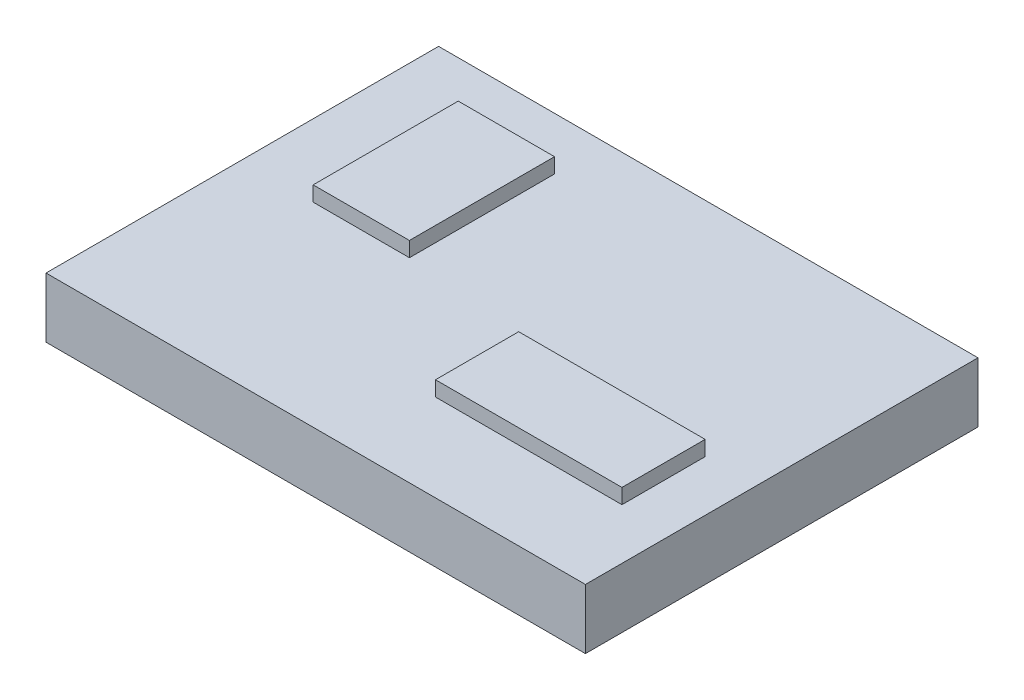
ISO-10303-21;
HEADER;
FILE_DESCRIPTION(('STEP AP214'),'2;1');
FILE_NAME('part.step','',(''),(''),'','','');
FILE_SCHEMA(('AUTOMOTIVE_DESIGN { 1 0 10303 214 1 1 1 1 }'));
ENDSEC;
DATA;
#1=APPLICATION_CONTEXT('core data for automotive mechanical design processes');
#2=APPLICATION_PROTOCOL_DEFINITION('international standard','automotive_design',2000,#1);
#3=PRODUCT_CONTEXT('',#1,'mechanical');
#4=PRODUCT('Part','Part','',(#3));
#5=PRODUCT_RELATED_PRODUCT_CATEGORY('part','',(#4));
#6=PRODUCT_DEFINITION_FORMATION('','',#4);
#7=PRODUCT_DEFINITION_CONTEXT('part definition',#1,'design');
#8=PRODUCT_DEFINITION('design','',#6,#7);
#9=PRODUCT_DEFINITION_SHAPE('','',#8);
#10=(LENGTH_UNIT() NAMED_UNIT(*) SI_UNIT(.MILLI.,.METRE.));
#11=(NAMED_UNIT(*) PLANE_ANGLE_UNIT() SI_UNIT($,.RADIAN.));
#12=(NAMED_UNIT(*) SI_UNIT($,.STERADIAN.) SOLID_ANGLE_UNIT());
#13=UNCERTAINTY_MEASURE_WITH_UNIT(LENGTH_MEASURE(1.E-05),#10,'distance_accuracy_value','');
#14=(GEOMETRIC_REPRESENTATION_CONTEXT(3) GLOBAL_UNCERTAINTY_ASSIGNED_CONTEXT((#13)) GLOBAL_UNIT_ASSIGNED_CONTEXT((#10,
#11,#12)) REPRESENTATION_CONTEXT('',''));
#15=CARTESIAN_POINT('',(0.,0.,0.));
#16=DIRECTION('',(0.,0.,1.));
#17=DIRECTION('',(1.,0.,0.));
#18=AXIS2_PLACEMENT_3D('',#15,#16,#17);
#19=CARTESIAN_POINT('',(0.,2.,0.));
#20=DIRECTION('',(0.,-1.,0.));
#21=DIRECTION('',(0.,0.,-1.));
#22=AXIS2_PLACEMENT_3D('',#19,#20,#21);
#23=PLANE('',#22);
#24=DIRECTION('',(0.,0.,1.));
#25=VECTOR('',#24,1.);
#26=CARTESIAN_POINT('',(2.40979553414755,2.,-11.3458514588061));
#27=LINE('',#26,#25);
#28=CARTESIAN_POINT('',(2.40979553414755,2.,-11.3458514588061));
#29=VERTEX_POINT('',#28);
#30=CARTESIAN_POINT('',(2.40979553414755,2.,-6.5048405479633));
#31=VERTEX_POINT('',#30);
#32=EDGE_CURVE('E142',#29,#31,#27,.T.);
#33=ORIENTED_EDGE('',*,*,#32,.F.);
#34=DIRECTION('',(-1.,0.,0.));
#35=VECTOR('',#34,1.);
#36=CARTESIAN_POINT('',(2.40979553414755,2.,-11.3458514588061));
#37=LINE('',#36,#35);
#38=CARTESIAN_POINT('',(5.6225188599015,2.,-11.3458514588061));
#39=VERTEX_POINT('',#38);
#40=EDGE_CURVE('E155',#39,#29,#37,.T.);
#41=ORIENTED_EDGE('',*,*,#40,.F.);
#42=DIRECTION('',(0.,0.,-1.));
#43=VECTOR('',#42,1.);
#44=CARTESIAN_POINT('',(5.6225188599015,2.,-11.3458514588061));
#45=LINE('',#44,#43);
#46=CARTESIAN_POINT('',(5.6225188599015,2.,-6.5048405479633));
#47=VERTEX_POINT('',#46);
#48=EDGE_CURVE('E164',#47,#39,#45,.T.);
#49=ORIENTED_EDGE('',*,*,#48,.F.);
#50=DIRECTION('',(1.,0.,0.));
#51=VECTOR('',#50,1.);
#52=CARTESIAN_POINT('',(2.40979553414755,2.,-6.5048405479633));
#53=LINE('',#52,#51);
#54=EDGE_CURVE('E145',#31,#47,#53,.T.);
#55=ORIENTED_EDGE('',*,*,#54,.F.);
#56=EDGE_LOOP('',(#33,#41,#49,#55));
#57=FACE_BOUND('',#56,.T.);
#58=DIRECTION('',(0.,0.,1.));
#59=VECTOR('',#58,1.);
#60=CARTESIAN_POINT('',(0.,2.,0.));
#61=LINE('',#60,#59);
#62=CARTESIAN_POINT('',(0.,2.,-13.1));
#63=VERTEX_POINT('',#62);
#64=CARTESIAN_POINT('',(0.,2.,0.));
#65=VERTEX_POINT('',#64);
#66=EDGE_CURVE('E181',#63,#65,#61,.T.);
#67=ORIENTED_EDGE('',*,*,#66,.T.);
#68=DIRECTION('',(1.,0.,0.));
#69=VECTOR('',#68,1.);
#70=CARTESIAN_POINT('',(0.,2.,0.));
#71=LINE('',#70,#69);
#72=CARTESIAN_POINT('',(18.,2.,0.));
#73=VERTEX_POINT('',#72);
#74=EDGE_CURVE('E184',#65,#73,#71,.T.);
#75=ORIENTED_EDGE('',*,*,#74,.T.);
#76=DIRECTION('',(0.,0.,-1.));
#77=VECTOR('',#76,1.);
#78=CARTESIAN_POINT('',(18.,2.,0.));
#79=LINE('',#78,#77);
#80=CARTESIAN_POINT('',(18.,2.,-13.1));
#81=VERTEX_POINT('',#80);
#82=EDGE_CURVE('E187',#73,#81,#79,.T.);
#83=ORIENTED_EDGE('',*,*,#82,.T.);
#84=DIRECTION('',(-1.,0.,0.));
#85=VECTOR('',#84,1.);
#86=CARTESIAN_POINT('',(0.,2.,-13.1));
#87=LINE('',#86,#85);
#88=EDGE_CURVE('E189',#81,#63,#87,.T.);
#89=ORIENTED_EDGE('',*,*,#88,.T.);
#90=EDGE_LOOP('',(#67,#75,#83,#89));
#91=FACE_BOUND('',#90,.T.);
#92=DIRECTION('',(0.,0.,1.));
#93=VECTOR('',#92,1.);
#94=CARTESIAN_POINT('',(10.0829261034403,2.,-5.69027774882791));
#95=LINE('',#94,#93);
#96=CARTESIAN_POINT('',(10.0829261034403,2.,-5.69027774882791));
#97=VERTEX_POINT('',#96);
#98=CARTESIAN_POINT('',(10.0829261034403,2.,-2.91406371153791));
#99=VERTEX_POINT('',#98);
#100=EDGE_CURVE('E141',#97,#99,#95,.T.);
#101=ORIENTED_EDGE('',*,*,#100,.F.);
#102=DIRECTION('',(-1.,0.,0.));
#103=VECTOR('',#102,1.);
#104=CARTESIAN_POINT('',(10.0829261034403,2.,-5.69027774882791));
#105=LINE('',#104,#103);
#106=CARTESIAN_POINT('',(16.3050454229077,2.,-5.69027774882791));
#107=VERTEX_POINT('',#106);
#108=EDGE_CURVE('E138',#107,#97,#105,.T.);
#109=ORIENTED_EDGE('',*,*,#108,.F.);
#110=DIRECTION('',(0.,0.,-1.));
#111=VECTOR('',#110,1.);
#112=CARTESIAN_POINT('',(16.3050454229077,2.,-5.69027774882791));
#113=LINE('',#112,#111);
#114=CARTESIAN_POINT('',(16.3050454229077,2.,-2.91406371153791));
#115=VERTEX_POINT('',#114);
#116=EDGE_CURVE('E52',#115,#107,#113,.T.);
#117=ORIENTED_EDGE('',*,*,#116,.F.);
#118=DIRECTION('',(1.,0.,0.));
#119=VECTOR('',#118,1.);
#120=CARTESIAN_POINT('',(10.0829261034403,2.,-2.91406371153791));
#121=LINE('',#120,#119);
#122=EDGE_CURVE('E47',#99,#115,#121,.T.);
#123=ORIENTED_EDGE('',*,*,#122,.F.);
#124=EDGE_LOOP('',(#101,#109,#117,#123));
#125=FACE_BOUND('',#124,.T.);
#126=ADVANCED_FACE('F32',(#57,#91,#125),#23,.F.);
#127=CARTESIAN_POINT('',(0.,2.,0.));
#128=DIRECTION('',(1.,0.,0.));
#129=DIRECTION('',(0.,0.,-1.));
#130=AXIS2_PLACEMENT_3D('',#127,#128,#129);
#131=PLANE('',#130);
#132=DIRECTION('',(0.,0.,1.));
#133=VECTOR('',#132,1.);
#134=CARTESIAN_POINT('',(0.,0.,0.));
#135=LINE('',#134,#133);
#136=CARTESIAN_POINT('',(0.,0.,-13.1));
#137=VERTEX_POINT('',#136);
#138=CARTESIAN_POINT('',(0.,0.,0.));
#139=VERTEX_POINT('',#138);
#140=EDGE_CURVE('E180',#137,#139,#135,.T.);
#141=ORIENTED_EDGE('',*,*,#140,.T.);
#142=DIRECTION('',(0.,-1.,0.));
#143=VECTOR('',#142,1.);
#144=CARTESIAN_POINT('',(0.,2.,0.));
#145=LINE('',#144,#143);
#146=EDGE_CURVE('E11',#65,#139,#145,.T.);
#147=ORIENTED_EDGE('',*,*,#146,.F.);
#148=ORIENTED_EDGE('',*,*,#66,.F.);
#149=DIRECTION('',(0.,-1.,0.));
#150=VECTOR('',#149,1.);
#151=CARTESIAN_POINT('',(0.,2.,-13.1));
#152=LINE('',#151,#150);
#153=EDGE_CURVE('E191',#63,#137,#152,.T.);
#154=ORIENTED_EDGE('',*,*,#153,.T.);
#155=EDGE_LOOP('',(#141,#147,#148,#154));
#156=FACE_BOUND('',#155,.T.);
#157=ADVANCED_FACE('F34',(#156),#131,.F.);
#158=CARTESIAN_POINT('',(0.,2.,0.));
#159=DIRECTION('',(0.,0.,-1.));
#160=DIRECTION('',(-1.,0.,0.));
#161=AXIS2_PLACEMENT_3D('',#158,#159,#160);
#162=PLANE('',#161);
#163=DIRECTION('',(1.,0.,0.));
#164=VECTOR('',#163,1.);
#165=CARTESIAN_POINT('',(0.,0.,0.));
#166=LINE('',#165,#164);
#167=CARTESIAN_POINT('',(18.,0.,0.));
#168=VERTEX_POINT('',#167);
#169=EDGE_CURVE('E194',#139,#168,#166,.T.);
#170=ORIENTED_EDGE('',*,*,#169,.T.);
#171=DIRECTION('',(0.,-1.,0.));
#172=VECTOR('',#171,1.);
#173=CARTESIAN_POINT('',(18.,2.,0.));
#174=LINE('',#173,#172);
#175=EDGE_CURVE('E40',#73,#168,#174,.T.);
#176=ORIENTED_EDGE('',*,*,#175,.F.);
#177=ORIENTED_EDGE('',*,*,#74,.F.);
#178=ORIENTED_EDGE('',*,*,#146,.T.);
#179=EDGE_LOOP('',(#170,#176,#177,#178));
#180=FACE_BOUND('',#179,.T.);
#181=ADVANCED_FACE('F223',(#180),#162,.F.);
#182=CARTESIAN_POINT('',(18.,2.,0.));
#183=DIRECTION('',(-1.,0.,0.));
#184=DIRECTION('',(0.,0.,1.));
#185=AXIS2_PLACEMENT_3D('',#182,#183,#184);
#186=PLANE('',#185);
#187=DIRECTION('',(0.,0.,-1.));
#188=VECTOR('',#187,1.);
#189=CARTESIAN_POINT('',(18.,0.,0.));
#190=LINE('',#189,#188);
#191=CARTESIAN_POINT('',(18.,0.,-13.1));
#192=VERTEX_POINT('',#191);
#193=EDGE_CURVE('E196',#168,#192,#190,.T.);
#194=ORIENTED_EDGE('',*,*,#193,.T.);
#195=DIRECTION('',(0.,-1.,0.));
#196=VECTOR('',#195,1.);
#197=CARTESIAN_POINT('',(18.,2.,-13.1));
#198=LINE('',#197,#196);
#199=EDGE_CURVE('E201',#81,#192,#198,.T.);
#200=ORIENTED_EDGE('',*,*,#199,.F.);
#201=ORIENTED_EDGE('',*,*,#82,.F.);
#202=ORIENTED_EDGE('',*,*,#175,.T.);
#203=EDGE_LOOP('',(#194,#200,#201,#202));
#204=FACE_BOUND('',#203,.T.);
#205=ADVANCED_FACE('F208',(#204),#186,.F.);
#206=CARTESIAN_POINT('',(0.,2.,-13.1));
#207=DIRECTION('',(0.,0.,1.));
#208=DIRECTION('',(1.,0.,0.));
#209=AXIS2_PLACEMENT_3D('',#206,#207,#208);
#210=PLANE('',#209);
#211=DIRECTION('',(-1.,0.,0.));
#212=VECTOR('',#211,1.);
#213=CARTESIAN_POINT('',(0.,0.,-13.1));
#214=LINE('',#213,#212);
#215=EDGE_CURVE('E185',#192,#137,#214,.T.);
#216=ORIENTED_EDGE('',*,*,#215,.T.);
#217=ORIENTED_EDGE('',*,*,#153,.F.);
#218=ORIENTED_EDGE('',*,*,#88,.F.);
#219=ORIENTED_EDGE('',*,*,#199,.T.);
#220=EDGE_LOOP('',(#216,#217,#218,#219));
#221=FACE_BOUND('',#220,.T.);
#222=ADVANCED_FACE('F217',(#221),#210,.F.);
#223=CARTESIAN_POINT('',(0.,0.,0.));
#224=DIRECTION('',(0.,-1.,0.));
#225=DIRECTION('',(0.,0.,-1.));
#226=AXIS2_PLACEMENT_3D('',#223,#224,#225);
#227=PLANE('',#226);
#228=ORIENTED_EDGE('',*,*,#140,.F.);
#229=ORIENTED_EDGE('',*,*,#215,.F.);
#230=ORIENTED_EDGE('',*,*,#193,.F.);
#231=ORIENTED_EDGE('',*,*,#169,.F.);
#232=EDGE_LOOP('',(#228,#229,#230,#231));
#233=FACE_BOUND('',#232,.T.);
#234=ADVANCED_FACE('F214',(#233),#227,.T.);
#235=CARTESIAN_POINT('',(2.40979553414755,2.5,-11.3458514588061));
#236=DIRECTION('',(1.,0.,0.));
#237=DIRECTION('',(0.,0.,-1.));
#238=AXIS2_PLACEMENT_3D('',#235,#236,#237);
#239=PLANE('',#238);
#240=ORIENTED_EDGE('',*,*,#32,.T.);
#241=DIRECTION('',(0.,-1.,0.));
#242=VECTOR('',#241,1.);
#243=CARTESIAN_POINT('',(2.40979553414755,2.5,-6.5048405479633));
#244=LINE('',#243,#242);
#245=CARTESIAN_POINT('',(2.40979553414755,2.5,-6.5048405479633));
#246=VERTEX_POINT('',#245);
#247=EDGE_CURVE('E177',#246,#31,#244,.T.);
#248=ORIENTED_EDGE('',*,*,#247,.F.);
#249=DIRECTION('',(0.,0.,1.));
#250=VECTOR('',#249,1.);
#251=CARTESIAN_POINT('',(2.40979553414755,2.5,-11.3458514588061));
#252=LINE('',#251,#250);
#253=CARTESIAN_POINT('',(2.40979553414755,2.5,-11.3458514588061));
#254=VERTEX_POINT('',#253);
#255=EDGE_CURVE('E151',#254,#246,#252,.T.);
#256=ORIENTED_EDGE('',*,*,#255,.F.);
#257=DIRECTION('',(0.,-1.,0.));
#258=VECTOR('',#257,1.);
#259=CARTESIAN_POINT('',(2.40979553414755,2.5,-11.3458514588061));
#260=LINE('',#259,#258);
#261=EDGE_CURVE('E160',#254,#29,#260,.T.);
#262=ORIENTED_EDGE('',*,*,#261,.T.);
#263=EDGE_LOOP('',(#240,#248,#256,#262));
#264=FACE_BOUND('',#263,.T.);
#265=ADVANCED_FACE('F237',(#264),#239,.F.);
#266=CARTESIAN_POINT('',(2.40979553414755,2.5,-6.5048405479633));
#267=DIRECTION('',(0.,0.,-1.));
#268=DIRECTION('',(-1.,0.,0.));
#269=AXIS2_PLACEMENT_3D('',#266,#267,#268);
#270=PLANE('',#269);
#271=ORIENTED_EDGE('',*,*,#54,.T.);
#272=DIRECTION('',(0.,-1.,0.));
#273=VECTOR('',#272,1.);
#274=CARTESIAN_POINT('',(5.6225188599015,2.5,-6.5048405479633));
#275=LINE('',#274,#273);
#276=CARTESIAN_POINT('',(5.6225188599015,2.5,-6.5048405479633));
#277=VERTEX_POINT('',#276);
#278=EDGE_CURVE('E174',#277,#47,#275,.T.);
#279=ORIENTED_EDGE('',*,*,#278,.F.);
#280=DIRECTION('',(1.,0.,0.));
#281=VECTOR('',#280,1.);
#282=CARTESIAN_POINT('',(2.40979553414755,2.5,-6.5048405479633));
#283=LINE('',#282,#281);
#284=EDGE_CURVE('E154',#246,#277,#283,.T.);
#285=ORIENTED_EDGE('',*,*,#284,.F.);
#286=ORIENTED_EDGE('',*,*,#247,.T.);
#287=EDGE_LOOP('',(#271,#279,#285,#286));
#288=FACE_BOUND('',#287,.T.);
#289=ADVANCED_FACE('F256',(#288),#270,.F.);
#290=CARTESIAN_POINT('',(5.6225188599015,2.5,-11.3458514588061));
#291=DIRECTION('',(-1.,0.,0.));
#292=DIRECTION('',(0.,0.,1.));
#293=AXIS2_PLACEMENT_3D('',#290,#291,#292);
#294=PLANE('',#293);
#295=ORIENTED_EDGE('',*,*,#48,.T.);
#296=DIRECTION('',(0.,-1.,0.));
#297=VECTOR('',#296,1.);
#298=CARTESIAN_POINT('',(5.6225188599015,2.5,-11.3458514588061));
#299=LINE('',#298,#297);
#300=CARTESIAN_POINT('',(5.6225188599015,2.5,-11.3458514588061));
#301=VERTEX_POINT('',#300);
#302=EDGE_CURVE('E171',#301,#39,#299,.T.);
#303=ORIENTED_EDGE('',*,*,#302,.F.);
#304=DIRECTION('',(0.,0.,-1.));
#305=VECTOR('',#304,1.);
#306=CARTESIAN_POINT('',(5.6225188599015,2.5,-11.3458514588061));
#307=LINE('',#306,#305);
#308=EDGE_CURVE('E157',#277,#301,#307,.T.);
#309=ORIENTED_EDGE('',*,*,#308,.F.);
#310=ORIENTED_EDGE('',*,*,#278,.T.);
#311=EDGE_LOOP('',(#295,#303,#309,#310));
#312=FACE_BOUND('',#311,.T.);
#313=ADVANCED_FACE('F263',(#312),#294,.F.);
#314=CARTESIAN_POINT('',(2.40979553414755,2.5,-11.3458514588061));
#315=DIRECTION('',(0.,0.,1.));
#316=DIRECTION('',(1.,0.,0.));
#317=AXIS2_PLACEMENT_3D('',#314,#315,#316);
#318=PLANE('',#317);
#319=ORIENTED_EDGE('',*,*,#40,.T.);
#320=ORIENTED_EDGE('',*,*,#261,.F.);
#321=DIRECTION('',(-1.,0.,0.));
#322=VECTOR('',#321,1.);
#323=CARTESIAN_POINT('',(2.40979553414755,2.5,-11.3458514588061));
#324=LINE('',#323,#322);
#325=EDGE_CURVE('E159',#301,#254,#324,.T.);
#326=ORIENTED_EDGE('',*,*,#325,.F.);
#327=ORIENTED_EDGE('',*,*,#302,.T.);
#328=EDGE_LOOP('',(#319,#320,#326,#327));
#329=FACE_BOUND('',#328,.T.);
#330=ADVANCED_FACE('F270',(#329),#318,.F.);
#331=CARTESIAN_POINT('',(0.,2.5,0.));
#332=DIRECTION('',(0.,1.,0.));
#333=DIRECTION('',(0.,0.,1.));
#334=AXIS2_PLACEMENT_3D('',#331,#332,#333);
#335=PLANE('',#334);
#336=ORIENTED_EDGE('',*,*,#255,.T.);
#337=ORIENTED_EDGE('',*,*,#284,.T.);
#338=ORIENTED_EDGE('',*,*,#308,.T.);
#339=ORIENTED_EDGE('',*,*,#325,.T.);
#340=EDGE_LOOP('',(#336,#337,#338,#339));
#341=FACE_BOUND('',#340,.T.);
#342=ADVANCED_FACE('F278',(#341),#335,.T.);
#343=CARTESIAN_POINT('',(10.0829261034403,2.5,-5.69027774882791));
#344=DIRECTION('',(1.,0.,0.));
#345=DIRECTION('',(0.,0.,-1.));
#346=AXIS2_PLACEMENT_3D('',#343,#344,#345);
#347=PLANE('',#346);
#348=ORIENTED_EDGE('',*,*,#100,.T.);
#349=DIRECTION('',(0.,-1.,0.));
#350=VECTOR('',#349,1.);
#351=CARTESIAN_POINT('',(10.0829261034403,2.5,-2.91406371153791));
#352=LINE('',#351,#350);
#353=CARTESIAN_POINT('',(10.0829261034403,2.5,-2.91406371153791));
#354=VERTEX_POINT('',#353);
#355=EDGE_CURVE('E122',#354,#99,#352,.T.);
#356=ORIENTED_EDGE('',*,*,#355,.F.);
#357=DIRECTION('',(0.,0.,1.));
#358=VECTOR('',#357,1.);
#359=CARTESIAN_POINT('',(10.0829261034403,2.5,-5.69027774882791));
#360=LINE('',#359,#358);
#361=CARTESIAN_POINT('',(10.0829261034403,2.5,-5.69027774882791));
#362=VERTEX_POINT('',#361);
#363=EDGE_CURVE('E129',#362,#354,#360,.T.);
#364=ORIENTED_EDGE('',*,*,#363,.F.);
#365=DIRECTION('',(0.,-1.,0.));
#366=VECTOR('',#365,1.);
#367=CARTESIAN_POINT('',(10.0829261034403,2.5,-5.69027774882791));
#368=LINE('',#367,#366);
#369=EDGE_CURVE('E367',#362,#97,#368,.T.);
#370=ORIENTED_EDGE('',*,*,#369,.T.);
#371=EDGE_LOOP('',(#348,#356,#364,#370));
#372=FACE_BOUND('',#371,.T.);
#373=ADVANCED_FACE('F140',(#372),#347,.F.);
#374=CARTESIAN_POINT('',(10.0829261034403,2.5,-2.91406371153791));
#375=DIRECTION('',(0.,0.,-1.));
#376=DIRECTION('',(-1.,0.,0.));
#377=AXIS2_PLACEMENT_3D('',#374,#375,#376);
#378=PLANE('',#377);
#379=ORIENTED_EDGE('',*,*,#122,.T.);
#380=DIRECTION('',(0.,-1.,0.));
#381=VECTOR('',#380,1.);
#382=CARTESIAN_POINT('',(16.3050454229077,2.5,-2.91406371153791));
#383=LINE('',#382,#381);
#384=CARTESIAN_POINT('',(16.3050454229077,2.5,-2.91406371153791));
#385=VERTEX_POINT('',#384);
#386=EDGE_CURVE('E125',#385,#115,#383,.T.);
#387=ORIENTED_EDGE('',*,*,#386,.F.);
#388=DIRECTION('',(1.,0.,0.));
#389=VECTOR('',#388,1.);
#390=CARTESIAN_POINT('',(10.0829261034403,2.5,-2.91406371153791));
#391=LINE('',#390,#389);
#392=EDGE_CURVE('E118',#354,#385,#391,.T.);
#393=ORIENTED_EDGE('',*,*,#392,.F.);
#394=ORIENTED_EDGE('',*,*,#355,.T.);
#395=EDGE_LOOP('',(#379,#387,#393,#394));
#396=FACE_BOUND('',#395,.T.);
#397=ADVANCED_FACE('F120',(#396),#378,.F.);
#398=CARTESIAN_POINT('',(16.3050454229077,2.5,-5.69027774882791));
#399=DIRECTION('',(-1.,0.,0.));
#400=DIRECTION('',(0.,0.,1.));
#401=AXIS2_PLACEMENT_3D('',#398,#399,#400);
#402=PLANE('',#401);
#403=ORIENTED_EDGE('',*,*,#116,.T.);
#404=DIRECTION('',(0.,-1.,0.));
#405=VECTOR('',#404,1.);
#406=CARTESIAN_POINT('',(16.3050454229077,2.5,-5.69027774882791));
#407=LINE('',#406,#405);
#408=CARTESIAN_POINT('',(16.3050454229077,2.5,-5.69027774882791));
#409=VERTEX_POINT('',#408);
#410=EDGE_CURVE('E147',#409,#107,#407,.T.);
#411=ORIENTED_EDGE('',*,*,#410,.F.);
#412=DIRECTION('',(0.,0.,-1.));
#413=VECTOR('',#412,1.);
#414=CARTESIAN_POINT('',(16.3050454229077,2.5,-5.69027774882791));
#415=LINE('',#414,#413);
#416=EDGE_CURVE('E128',#385,#409,#415,.T.);
#417=ORIENTED_EDGE('',*,*,#416,.F.);
#418=ORIENTED_EDGE('',*,*,#386,.T.);
#419=EDGE_LOOP('',(#403,#411,#417,#418));
#420=FACE_BOUND('',#419,.T.);
#421=ADVANCED_FACE('F299',(#420),#402,.F.);
#422=CARTESIAN_POINT('',(10.0829261034403,2.5,-5.69027774882791));
#423=DIRECTION('',(0.,0.,1.));
#424=DIRECTION('',(1.,0.,0.));
#425=AXIS2_PLACEMENT_3D('',#422,#423,#424);
#426=PLANE('',#425);
#427=ORIENTED_EDGE('',*,*,#108,.T.);
#428=ORIENTED_EDGE('',*,*,#369,.F.);
#429=DIRECTION('',(-1.,0.,0.));
#430=VECTOR('',#429,1.);
#431=CARTESIAN_POINT('',(10.0829261034403,2.5,-5.69027774882791));
#432=LINE('',#431,#430);
#433=EDGE_CURVE('E134',#409,#362,#432,.T.);
#434=ORIENTED_EDGE('',*,*,#433,.F.);
#435=ORIENTED_EDGE('',*,*,#410,.T.);
#436=EDGE_LOOP('',(#427,#428,#434,#435));
#437=FACE_BOUND('',#436,.T.);
#438=ADVANCED_FACE('F306',(#437),#426,.F.);
#439=CARTESIAN_POINT('',(0.,2.5,0.));
#440=DIRECTION('',(0.,1.,0.));
#441=DIRECTION('',(0.,0.,1.));
#442=AXIS2_PLACEMENT_3D('',#439,#440,#441);
#443=PLANE('',#442);
#444=ORIENTED_EDGE('',*,*,#363,.T.);
#445=ORIENTED_EDGE('',*,*,#392,.T.);
#446=ORIENTED_EDGE('',*,*,#416,.T.);
#447=ORIENTED_EDGE('',*,*,#433,.T.);
#448=EDGE_LOOP('',(#444,#445,#446,#447));
#449=FACE_BOUND('',#448,.T.);
#450=ADVANCED_FACE('F132',(#449),#443,.T.);
#451=CLOSED_SHELL('',(#126,#157,#181,#205,#222,#234,#265,#289,#313,#330,#342,#373,#397,#421,
#438,#450));
#452=MANIFOLD_SOLID_BREP('B2',#451);
#453=ADVANCED_BREP_SHAPE_REPRESENTATION('',(#18,#452),#14);
#454=SHAPE_DEFINITION_REPRESENTATION(#9,#453);
ENDSEC;
END-ISO-10303-21;
